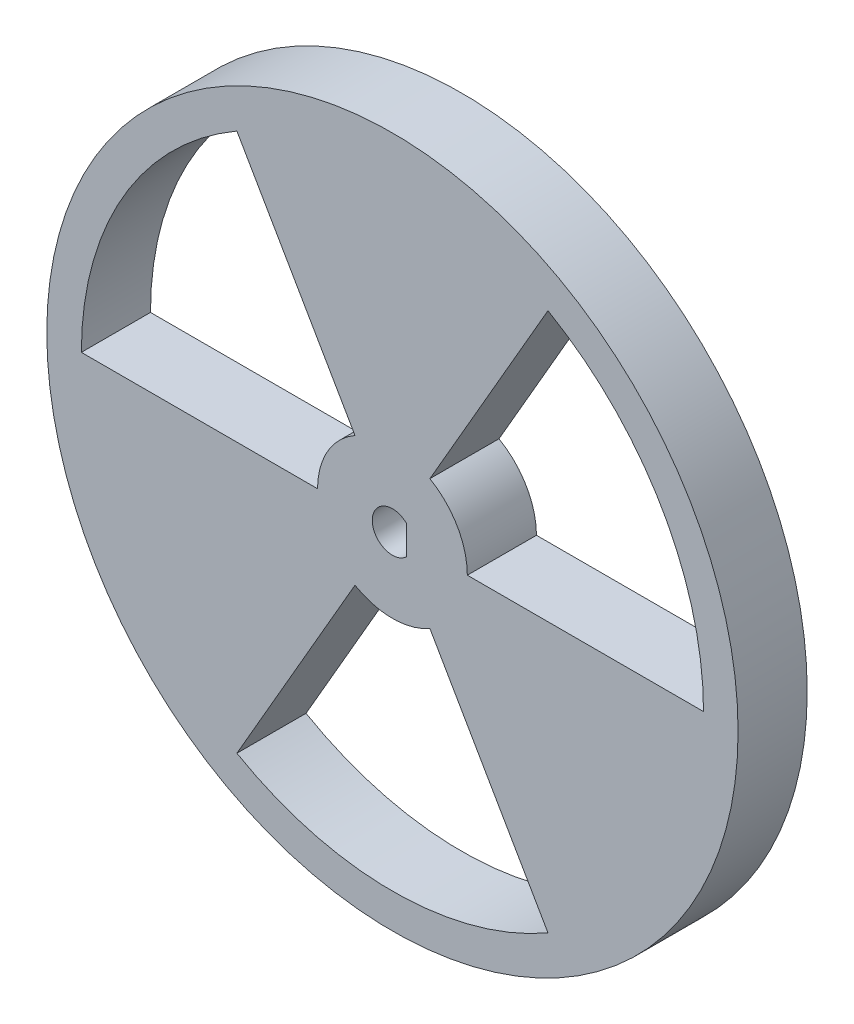
ISO-10303-21;
HEADER;
FILE_DESCRIPTION(('STEP AP214'),'2;1');
FILE_NAME('part.step','',(''),(''),'','','');
FILE_SCHEMA(('AUTOMOTIVE_DESIGN { 1 0 10303 214 1 1 1 1 }'));
ENDSEC;
DATA;
#1=APPLICATION_CONTEXT('core data for automotive mechanical design processes');
#2=APPLICATION_PROTOCOL_DEFINITION('international standard','automotive_design',2000,#1);
#3=PRODUCT_CONTEXT('',#1,'mechanical');
#4=PRODUCT('Part','Part','',(#3));
#5=PRODUCT_RELATED_PRODUCT_CATEGORY('part','',(#4));
#6=PRODUCT_DEFINITION_FORMATION('','',#4);
#7=PRODUCT_DEFINITION_CONTEXT('part definition',#1,'design');
#8=PRODUCT_DEFINITION('design','',#6,#7);
#9=PRODUCT_DEFINITION_SHAPE('','',#8);
#10=(LENGTH_UNIT() NAMED_UNIT(*) SI_UNIT(.MILLI.,.METRE.));
#11=(NAMED_UNIT(*) PLANE_ANGLE_UNIT() SI_UNIT($,.RADIAN.));
#12=(NAMED_UNIT(*) SI_UNIT($,.STERADIAN.) SOLID_ANGLE_UNIT());
#13=UNCERTAINTY_MEASURE_WITH_UNIT(LENGTH_MEASURE(1.E-05),#10,'distance_accuracy_value','');
#14=(GEOMETRIC_REPRESENTATION_CONTEXT(3) GLOBAL_UNCERTAINTY_ASSIGNED_CONTEXT((#13)) GLOBAL_UNIT_ASSIGNED_CONTEXT((#10,
#11,#12)) REPRESENTATION_CONTEXT('',''));
#15=CARTESIAN_POINT('',(0.,0.,0.));
#16=DIRECTION('',(0.,0.,1.));
#17=DIRECTION('',(1.,0.,0.));
#18=AXIS2_PLACEMENT_3D('',#15,#16,#17);
#19=CARTESIAN_POINT('',(0.,0.,12.));
#20=DIRECTION('',(0.,0.,-1.));
#21=DIRECTION('',(-1.,0.,0.));
#22=AXIS2_PLACEMENT_3D('',#19,#20,#21);
#23=CYLINDRICAL_SURFACE('',#22,60.);
#24=CARTESIAN_POINT('',(0.,0.,12.));
#25=DIRECTION('',(0.,0.,1.));
#26=DIRECTION('',(1.,0.,0.));
#27=AXIS2_PLACEMENT_3D('',#24,#25,#26);
#28=CIRCLE('',#27,60.);
#29=CARTESIAN_POINT('',(60.,0.,12.));
#30=VERTEX_POINT('',#29);
#31=EDGE_CURVE('E184',#30,#30,#28,.T.);
#32=ORIENTED_EDGE('',*,*,#31,.F.);
#33=EDGE_LOOP('',(#32));
#34=FACE_BOUND('',#33,.T.);
#35=CARTESIAN_POINT('',(0.,0.,0.));
#36=DIRECTION('',(0.,0.,1.));
#37=DIRECTION('',(1.,0.,0.));
#38=AXIS2_PLACEMENT_3D('',#35,#36,#37);
#39=CIRCLE('',#38,60.);
#40=CARTESIAN_POINT('',(60.,0.,0.));
#41=VERTEX_POINT('',#40);
#42=EDGE_CURVE('E165',#41,#41,#39,.T.);
#43=ORIENTED_EDGE('',*,*,#42,.T.);
#44=EDGE_LOOP('',(#43));
#45=FACE_BOUND('',#44,.T.);
#46=ADVANCED_FACE('F41',(#34,#45),#23,.T.);
#47=CARTESIAN_POINT('',(0.,0.,12.));
#48=DIRECTION('',(0.,1.,0.));
#49=DIRECTION('',(0.,0.,1.));
#50=AXIS2_PLACEMENT_3D('',#47,#48,#49);
#51=PLANE('',#50);
#52=DIRECTION('',(1.,0.,0.));
#53=VECTOR('',#52,1.);
#54=CARTESIAN_POINT('',(0.,0.,0.));
#55=LINE('',#54,#53);
#56=CARTESIAN_POINT('',(13.,0.,0.));
#57=VERTEX_POINT('',#56);
#58=CARTESIAN_POINT('',(54.,0.,0.));
#59=VERTEX_POINT('',#58);
#60=EDGE_CURVE('E191',#57,#59,#55,.T.);
#61=ORIENTED_EDGE('',*,*,#60,.F.);
#62=DIRECTION('',(0.,0.,-1.));
#63=VECTOR('',#62,1.);
#64=CARTESIAN_POINT('',(13.,0.,12.));
#65=LINE('',#64,#63);
#66=CARTESIAN_POINT('',(13.,0.,12.));
#67=VERTEX_POINT('',#66);
#68=EDGE_CURVE('E50',#67,#57,#65,.T.);
#69=ORIENTED_EDGE('',*,*,#68,.F.);
#70=DIRECTION('',(1.,0.,0.));
#71=VECTOR('',#70,1.);
#72=CARTESIAN_POINT('',(0.,0.,12.));
#73=LINE('',#72,#71);
#74=CARTESIAN_POINT('',(54.,0.,12.));
#75=VERTEX_POINT('',#74);
#76=EDGE_CURVE('E164',#67,#75,#73,.T.);
#77=ORIENTED_EDGE('',*,*,#76,.T.);
#78=DIRECTION('',(0.,0.,-1.));
#79=VECTOR('',#78,1.);
#80=CARTESIAN_POINT('',(54.,0.,12.));
#81=LINE('',#80,#79);
#82=EDGE_CURVE('E12',#75,#59,#81,.T.);
#83=ORIENTED_EDGE('',*,*,#82,.T.);
#84=EDGE_LOOP('',(#61,#69,#77,#83));
#85=FACE_BOUND('',#84,.T.);
#86=ADVANCED_FACE('F298',(#85),#51,.T.);
#87=CARTESIAN_POINT('',(0.,0.,12.));
#88=DIRECTION('',(0.866025403784439,0.5,0.));
#89=DIRECTION('',(-0.5,0.866025403784439,0.));
#90=AXIS2_PLACEMENT_3D('',#87,#88,#89);
#91=PLANE('',#90);
#92=DIRECTION('',(0.5,-0.866025403784439,0.));
#93=VECTOR('',#92,1.);
#94=CARTESIAN_POINT('',(0.,0.,0.));
#95=LINE('',#94,#93);
#96=CARTESIAN_POINT('',(6.5,-11.2583302491977,0.));
#97=VERTEX_POINT('',#96);
#98=CARTESIAN_POINT('',(27.,-46.7653718043597,0.));
#99=VERTEX_POINT('',#98);
#100=EDGE_CURVE('E197',#97,#99,#95,.T.);
#101=ORIENTED_EDGE('',*,*,#100,.T.);
#102=DIRECTION('',(0.,0.,-1.));
#103=VECTOR('',#102,1.);
#104=CARTESIAN_POINT('',(27.,-46.7653718043597,12.));
#105=LINE('',#104,#103);
#106=CARTESIAN_POINT('',(27.,-46.7653718043597,12.));
#107=VERTEX_POINT('',#106);
#108=EDGE_CURVE('E229',#107,#99,#105,.T.);
#109=ORIENTED_EDGE('',*,*,#108,.F.);
#110=DIRECTION('',(0.5,-0.866025403784439,0.));
#111=VECTOR('',#110,1.);
#112=CARTESIAN_POINT('',(0.,0.,12.));
#113=LINE('',#112,#111);
#114=CARTESIAN_POINT('',(6.5,-11.2583302491977,12.));
#115=VERTEX_POINT('',#114);
#116=EDGE_CURVE('E170',#115,#107,#113,.T.);
#117=ORIENTED_EDGE('',*,*,#116,.F.);
#118=DIRECTION('',(0.,0.,-1.));
#119=VECTOR('',#118,1.);
#120=CARTESIAN_POINT('',(6.5,-11.2583302491977,12.));
#121=LINE('',#120,#119);
#122=EDGE_CURVE('E231',#115,#97,#121,.T.);
#123=ORIENTED_EDGE('',*,*,#122,.T.);
#124=EDGE_LOOP('',(#101,#109,#117,#123));
#125=FACE_BOUND('',#124,.T.);
#126=ADVANCED_FACE('F261',(#125),#91,.F.);
#127=CARTESIAN_POINT('',(0.,0.,12.));
#128=DIRECTION('',(0.,0.,-1.));
#129=DIRECTION('',(-1.,0.,0.));
#130=AXIS2_PLACEMENT_3D('',#127,#128,#129);
#131=CYLINDRICAL_SURFACE('',#130,54.);
#132=CARTESIAN_POINT('',(0.,0.,0.));
#133=DIRECTION('',(0.,0.,1.));
#134=DIRECTION('',(1.,0.,0.));
#135=AXIS2_PLACEMENT_3D('',#132,#133,#134);
#136=CIRCLE('',#135,54.);
#137=CARTESIAN_POINT('',(-27.,-46.7653718043597,0.));
#138=VERTEX_POINT('',#137);
#139=EDGE_CURVE('E194',#138,#99,#136,.T.);
#140=ORIENTED_EDGE('',*,*,#139,.F.);
#141=DIRECTION('',(0.,0.,-1.));
#142=VECTOR('',#141,1.);
#143=CARTESIAN_POINT('',(-27.,-46.7653718043597,12.));
#144=LINE('',#143,#142);
#145=CARTESIAN_POINT('',(-27.,-46.7653718043597,12.));
#146=VERTEX_POINT('',#145);
#147=EDGE_CURVE('E227',#146,#138,#144,.T.);
#148=ORIENTED_EDGE('',*,*,#147,.F.);
#149=CARTESIAN_POINT('',(0.,0.,12.));
#150=DIRECTION('',(0.,0.,1.));
#151=DIRECTION('',(1.,0.,0.));
#152=AXIS2_PLACEMENT_3D('',#149,#150,#151);
#153=CIRCLE('',#152,54.);
#154=EDGE_CURVE('E167',#146,#107,#153,.T.);
#155=ORIENTED_EDGE('',*,*,#154,.T.);
#156=ORIENTED_EDGE('',*,*,#108,.T.);
#157=EDGE_LOOP('',(#140,#148,#155,#156));
#158=FACE_BOUND('',#157,.T.);
#159=ADVANCED_FACE('F318',(#158),#131,.F.);
#160=CARTESIAN_POINT('',(0.,0.,12.));
#161=DIRECTION('',(-0.866025403784439,0.5,0.));
#162=DIRECTION('',(-0.5,-0.866025403784439,0.));
#163=AXIS2_PLACEMENT_3D('',#160,#161,#162);
#164=PLANE('',#163);
#165=DIRECTION('',(0.5,0.866025403784439,0.));
#166=VECTOR('',#165,1.);
#167=CARTESIAN_POINT('',(0.,0.,0.));
#168=LINE('',#167,#166);
#169=CARTESIAN_POINT('',(-6.5,-11.2583302491977,0.));
#170=VERTEX_POINT('',#169);
#171=EDGE_CURVE('E200',#138,#170,#168,.T.);
#172=ORIENTED_EDGE('',*,*,#171,.T.);
#173=DIRECTION('',(0.,0.,-1.));
#174=VECTOR('',#173,1.);
#175=CARTESIAN_POINT('',(-6.5,-11.2583302491977,12.));
#176=LINE('',#175,#174);
#177=CARTESIAN_POINT('',(-6.5,-11.2583302491977,12.));
#178=VERTEX_POINT('',#177);
#179=EDGE_CURVE('E225',#178,#170,#176,.T.);
#180=ORIENTED_EDGE('',*,*,#179,.F.);
#181=DIRECTION('',(0.5,0.866025403784439,0.));
#182=VECTOR('',#181,1.);
#183=CARTESIAN_POINT('',(0.,0.,12.));
#184=LINE('',#183,#182);
#185=EDGE_CURVE('E172',#146,#178,#184,.T.);
#186=ORIENTED_EDGE('',*,*,#185,.F.);
#187=ORIENTED_EDGE('',*,*,#147,.T.);
#188=EDGE_LOOP('',(#172,#180,#186,#187));
#189=FACE_BOUND('',#188,.T.);
#190=ADVANCED_FACE('F321',(#189),#164,.F.);
#191=CARTESIAN_POINT('',(0.,0.,12.));
#192=DIRECTION('',(0.,1.,0.));
#193=DIRECTION('',(0.,0.,1.));
#194=AXIS2_PLACEMENT_3D('',#191,#192,#193);
#195=PLANE('',#194);
#196=DIRECTION('',(1.,0.,0.));
#197=VECTOR('',#196,1.);
#198=CARTESIAN_POINT('',(0.,0.,0.));
#199=LINE('',#198,#197);
#200=CARTESIAN_POINT('',(-54.,0.,0.));
#201=VERTEX_POINT('',#200);
#202=CARTESIAN_POINT('',(-13.,0.,0.));
#203=VERTEX_POINT('',#202);
#204=EDGE_CURVE('E203',#201,#203,#199,.T.);
#205=ORIENTED_EDGE('',*,*,#204,.F.);
#206=DIRECTION('',(0.,0.,-1.));
#207=VECTOR('',#206,1.);
#208=CARTESIAN_POINT('',(-54.,0.,12.));
#209=LINE('',#208,#207);
#210=CARTESIAN_POINT('',(-54.,0.,12.));
#211=VERTEX_POINT('',#210);
#212=EDGE_CURVE('E221',#211,#201,#209,.T.);
#213=ORIENTED_EDGE('',*,*,#212,.F.);
#214=DIRECTION('',(1.,0.,0.));
#215=VECTOR('',#214,1.);
#216=CARTESIAN_POINT('',(0.,0.,12.));
#217=LINE('',#216,#215);
#218=CARTESIAN_POINT('',(-13.,0.,12.));
#219=VERTEX_POINT('',#218);
#220=EDGE_CURVE('E175',#211,#219,#217,.T.);
#221=ORIENTED_EDGE('',*,*,#220,.T.);
#222=DIRECTION('',(0.,0.,-1.));
#223=VECTOR('',#222,1.);
#224=CARTESIAN_POINT('',(-13.,0.,12.));
#225=LINE('',#224,#223);
#226=EDGE_CURVE('E223',#219,#203,#225,.T.);
#227=ORIENTED_EDGE('',*,*,#226,.T.);
#228=EDGE_LOOP('',(#205,#213,#221,#227));
#229=FACE_BOUND('',#228,.T.);
#230=ADVANCED_FACE('F278',(#229),#195,.T.);
#231=CARTESIAN_POINT('',(-27.,46.7653718043597,0.));
#232=VERTEX_POINT('',#231);
#233=EDGE_CURVE('E193',#232,#201,#136,.T.);
#234=ORIENTED_EDGE('',*,*,#233,.F.);
#235=DIRECTION('',(0.,0.,-1.));
#236=VECTOR('',#235,1.);
#237=CARTESIAN_POINT('',(-27.,46.7653718043597,12.));
#238=LINE('',#237,#236);
#239=CARTESIAN_POINT('',(-27.,46.7653718043597,12.));
#240=VERTEX_POINT('',#239);
#241=EDGE_CURVE('E219',#240,#232,#238,.T.);
#242=ORIENTED_EDGE('',*,*,#241,.F.);
#243=EDGE_CURVE('E166',#240,#211,#153,.T.);
#244=ORIENTED_EDGE('',*,*,#243,.T.);
#245=ORIENTED_EDGE('',*,*,#212,.T.);
#246=EDGE_LOOP('',(#234,#242,#244,#245));
#247=FACE_BOUND('',#246,.T.);
#248=ADVANCED_FACE('F271',(#247),#131,.F.);
#249=CARTESIAN_POINT('',(0.,0.,12.));
#250=DIRECTION('',(0.866025403784439,0.5,0.));
#251=DIRECTION('',(-0.5,0.866025403784439,0.));
#252=AXIS2_PLACEMENT_3D('',#249,#250,#251);
#253=PLANE('',#252);
#254=DIRECTION('',(0.5,-0.866025403784439,0.));
#255=VECTOR('',#254,1.);
#256=CARTESIAN_POINT('',(0.,0.,0.));
#257=LINE('',#256,#255);
#258=CARTESIAN_POINT('',(-6.5,11.2583302491977,0.));
#259=VERTEX_POINT('',#258);
#260=EDGE_CURVE('E206',#232,#259,#257,.T.);
#261=ORIENTED_EDGE('',*,*,#260,.T.);
#262=DIRECTION('',(0.,0.,-1.));
#263=VECTOR('',#262,1.);
#264=CARTESIAN_POINT('',(-6.5,11.2583302491977,12.));
#265=LINE('',#264,#263);
#266=CARTESIAN_POINT('',(-6.5,11.2583302491977,12.));
#267=VERTEX_POINT('',#266);
#268=EDGE_CURVE('E217',#267,#259,#265,.T.);
#269=ORIENTED_EDGE('',*,*,#268,.F.);
#270=DIRECTION('',(0.5,-0.866025403784439,0.));
#271=VECTOR('',#270,1.);
#272=CARTESIAN_POINT('',(0.,0.,12.));
#273=LINE('',#272,#271);
#274=EDGE_CURVE('E178',#240,#267,#273,.T.);
#275=ORIENTED_EDGE('',*,*,#274,.F.);
#276=ORIENTED_EDGE('',*,*,#241,.T.);
#277=EDGE_LOOP('',(#261,#269,#275,#276));
#278=FACE_BOUND('',#277,.T.);
#279=ADVANCED_FACE('F284',(#278),#253,.F.);
#280=CARTESIAN_POINT('',(0.,0.,12.));
#281=DIRECTION('',(0.866025403784439,-0.5,0.));
#282=DIRECTION('',(0.5,0.866025403784439,0.));
#283=AXIS2_PLACEMENT_3D('',#280,#281,#282);
#284=PLANE('',#283);
#285=DIRECTION('',(-0.5,-0.866025403784439,0.));
#286=VECTOR('',#285,1.);
#287=CARTESIAN_POINT('',(0.,0.,0.));
#288=LINE('',#287,#286);
#289=CARTESIAN_POINT('',(27.,46.7653718043597,0.));
#290=VERTEX_POINT('',#289);
#291=CARTESIAN_POINT('',(6.5,11.2583302491977,0.));
#292=VERTEX_POINT('',#291);
#293=EDGE_CURVE('E209',#290,#292,#288,.T.);
#294=ORIENTED_EDGE('',*,*,#293,.F.);
#295=DIRECTION('',(0.,0.,-1.));
#296=VECTOR('',#295,1.);
#297=CARTESIAN_POINT('',(27.,46.7653718043597,12.));
#298=LINE('',#297,#296);
#299=CARTESIAN_POINT('',(27.,46.7653718043597,12.));
#300=VERTEX_POINT('',#299);
#301=EDGE_CURVE('E187',#300,#290,#298,.T.);
#302=ORIENTED_EDGE('',*,*,#301,.F.);
#303=DIRECTION('',(-0.5,-0.866025403784439,0.));
#304=VECTOR('',#303,1.);
#305=CARTESIAN_POINT('',(0.,0.,12.));
#306=LINE('',#305,#304);
#307=CARTESIAN_POINT('',(6.5,11.2583302491977,12.));
#308=VERTEX_POINT('',#307);
#309=EDGE_CURVE('E181',#300,#308,#306,.T.);
#310=ORIENTED_EDGE('',*,*,#309,.T.);
#311=DIRECTION('',(0.,0.,-1.));
#312=VECTOR('',#311,1.);
#313=CARTESIAN_POINT('',(6.5,11.2583302491977,12.));
#314=LINE('',#313,#312);
#315=EDGE_CURVE('E215',#308,#292,#314,.T.);
#316=ORIENTED_EDGE('',*,*,#315,.T.);
#317=EDGE_LOOP('',(#294,#302,#310,#316));
#318=FACE_BOUND('',#317,.T.);
#319=ADVANCED_FACE('F309',(#318),#284,.T.);
#320=EDGE_CURVE('E188',#59,#290,#136,.T.);
#321=ORIENTED_EDGE('',*,*,#320,.F.);
#322=ORIENTED_EDGE('',*,*,#82,.F.);
#323=EDGE_CURVE('E161',#75,#300,#153,.T.);
#324=ORIENTED_EDGE('',*,*,#323,.T.);
#325=ORIENTED_EDGE('',*,*,#301,.T.);
#326=EDGE_LOOP('',(#321,#322,#324,#325));
#327=FACE_BOUND('',#326,.T.);
#328=ADVANCED_FACE('F312',(#327),#131,.F.);
#329=CARTESIAN_POINT('',(0.,0.,0.));
#330=DIRECTION('',(0.,0.,1.));
#331=DIRECTION('',(1.,0.,0.));
#332=AXIS2_PLACEMENT_3D('',#329,#330,#331);
#333=PLANE('',#332);
#334=DIRECTION('',(0.,-1.,0.));
#335=VECTOR('',#334,1.);
#336=CARTESIAN_POINT('',(2.44948974278318,2.5,0.));
#337=LINE('',#336,#335);
#338=CARTESIAN_POINT('',(2.44948974278318,2.5,0.));
#339=VERTEX_POINT('',#338);
#340=CARTESIAN_POINT('',(2.44948974278318,-2.5,0.));
#341=VERTEX_POINT('',#340);
#342=EDGE_CURVE('E158',#339,#341,#337,.T.);
#343=ORIENTED_EDGE('',*,*,#342,.F.);
#344=CARTESIAN_POINT('',(0.,0.,0.));
#345=DIRECTION('',(0.,0.,1.));
#346=DIRECTION('',(1.,0.,0.));
#347=AXIS2_PLACEMENT_3D('',#344,#345,#346);
#348=CIRCLE('',#347,3.5);
#349=EDGE_CURVE('E143',#341,#339,#348,.F.);
#350=ORIENTED_EDGE('',*,*,#349,.F.);
#351=EDGE_LOOP('',(#343,#350));
#352=FACE_BOUND('',#351,.T.);
#353=CARTESIAN_POINT('',(0.,0.,0.));
#354=DIRECTION('',(0.,0.,1.));
#355=DIRECTION('',(1.,0.,0.));
#356=AXIS2_PLACEMENT_3D('',#353,#354,#355);
#357=CIRCLE('',#356,13.);
#358=EDGE_CURVE('E45',#57,#292,#357,.T.);
#359=ORIENTED_EDGE('',*,*,#358,.F.);
#360=ORIENTED_EDGE('',*,*,#60,.T.);
#361=ORIENTED_EDGE('',*,*,#320,.T.);
#362=ORIENTED_EDGE('',*,*,#293,.T.);
#363=EDGE_LOOP('',(#359,#360,#361,#362));
#364=FACE_BOUND('',#363,.T.);
#365=EDGE_CURVE('E160',#170,#97,#357,.T.);
#366=ORIENTED_EDGE('',*,*,#365,.F.);
#367=ORIENTED_EDGE('',*,*,#171,.F.);
#368=ORIENTED_EDGE('',*,*,#139,.T.);
#369=ORIENTED_EDGE('',*,*,#100,.F.);
#370=EDGE_LOOP('',(#366,#367,#368,#369));
#371=FACE_BOUND('',#370,.T.);
#372=ORIENTED_EDGE('',*,*,#204,.T.);
#373=EDGE_CURVE('E245',#259,#203,#357,.T.);
#374=ORIENTED_EDGE('',*,*,#373,.F.);
#375=ORIENTED_EDGE('',*,*,#260,.F.);
#376=ORIENTED_EDGE('',*,*,#233,.T.);
#377=EDGE_LOOP('',(#372,#374,#375,#376));
#378=FACE_BOUND('',#377,.T.);
#379=ORIENTED_EDGE('',*,*,#42,.F.);
#380=EDGE_LOOP('',(#379));
#381=FACE_BOUND('',#380,.T.);
#382=ADVANCED_FACE('F256',(#352,#364,#371,#378,#381),#333,.F.);
#383=CARTESIAN_POINT('',(0.,0.,12.));
#384=DIRECTION('',(0.,0.,1.));
#385=DIRECTION('',(1.,0.,0.));
#386=AXIS2_PLACEMENT_3D('',#383,#384,#385);
#387=PLANE('',#386);
#388=CARTESIAN_POINT('',(0.,0.,12.));
#389=DIRECTION('',(0.,0.,1.));
#390=DIRECTION('',(1.,0.,0.));
#391=AXIS2_PLACEMENT_3D('',#388,#389,#390);
#392=CIRCLE('',#391,3.5);
#393=CARTESIAN_POINT('',(2.44948974278318,2.5,12.));
#394=VERTEX_POINT('',#393);
#395=CARTESIAN_POINT('',(2.44948974278318,-2.5,12.));
#396=VERTEX_POINT('',#395);
#397=EDGE_CURVE('E65',#394,#396,#392,.T.);
#398=ORIENTED_EDGE('',*,*,#397,.F.);
#399=DIRECTION('',(0.,1.,0.));
#400=VECTOR('',#399,1.);
#401=CARTESIAN_POINT('',(2.44948974278318,2.5,12.));
#402=LINE('',#401,#400);
#403=EDGE_CURVE('E148',#396,#394,#402,.T.);
#404=ORIENTED_EDGE('',*,*,#403,.F.);
#405=EDGE_LOOP('',(#398,#404));
#406=FACE_BOUND('',#405,.T.);
#407=ORIENTED_EDGE('',*,*,#76,.F.);
#408=CARTESIAN_POINT('',(0.,0.,12.));
#409=DIRECTION('',(0.,0.,1.));
#410=DIRECTION('',(1.,0.,0.));
#411=AXIS2_PLACEMENT_3D('',#408,#409,#410);
#412=CIRCLE('',#411,13.);
#413=EDGE_CURVE('E192',#67,#308,#412,.T.);
#414=ORIENTED_EDGE('',*,*,#413,.T.);
#415=ORIENTED_EDGE('',*,*,#309,.F.);
#416=ORIENTED_EDGE('',*,*,#323,.F.);
#417=EDGE_LOOP('',(#407,#414,#415,#416));
#418=FACE_BOUND('',#417,.T.);
#419=ORIENTED_EDGE('',*,*,#185,.T.);
#420=EDGE_CURVE('E235',#178,#115,#412,.T.);
#421=ORIENTED_EDGE('',*,*,#420,.T.);
#422=ORIENTED_EDGE('',*,*,#116,.T.);
#423=ORIENTED_EDGE('',*,*,#154,.F.);
#424=EDGE_LOOP('',(#419,#421,#422,#423));
#425=FACE_BOUND('',#424,.T.);
#426=EDGE_CURVE('E234',#267,#219,#412,.T.);
#427=ORIENTED_EDGE('',*,*,#426,.T.);
#428=ORIENTED_EDGE('',*,*,#220,.F.);
#429=ORIENTED_EDGE('',*,*,#243,.F.);
#430=ORIENTED_EDGE('',*,*,#274,.T.);
#431=EDGE_LOOP('',(#427,#428,#429,#430));
#432=FACE_BOUND('',#431,.T.);
#433=ORIENTED_EDGE('',*,*,#31,.T.);
#434=EDGE_LOOP('',(#433));
#435=FACE_BOUND('',#434,.T.);
#436=ADVANCED_FACE('F152',(#406,#418,#425,#432,#435),#387,.T.);
#437=CARTESIAN_POINT('',(0.,0.,12.));
#438=DIRECTION('',(0.,0.,-1.));
#439=DIRECTION('',(-1.,0.,0.));
#440=AXIS2_PLACEMENT_3D('',#437,#438,#439);
#441=CYLINDRICAL_SURFACE('',#440,13.);
#442=ORIENTED_EDGE('',*,*,#226,.F.);
#443=ORIENTED_EDGE('',*,*,#426,.F.);
#444=ORIENTED_EDGE('',*,*,#268,.T.);
#445=ORIENTED_EDGE('',*,*,#373,.T.);
#446=EDGE_LOOP('',(#442,#443,#444,#445));
#447=FACE_BOUND('',#446,.T.);
#448=ADVANCED_FACE('F286',(#447),#441,.T.);
#449=ORIENTED_EDGE('',*,*,#365,.T.);
#450=ORIENTED_EDGE('',*,*,#122,.F.);
#451=ORIENTED_EDGE('',*,*,#420,.F.);
#452=ORIENTED_EDGE('',*,*,#179,.T.);
#453=EDGE_LOOP('',(#449,#450,#451,#452));
#454=FACE_BOUND('',#453,.T.);
#455=ADVANCED_FACE('F43',(#454),#441,.T.);
#456=ORIENTED_EDGE('',*,*,#68,.T.);
#457=ORIENTED_EDGE('',*,*,#358,.T.);
#458=ORIENTED_EDGE('',*,*,#315,.F.);
#459=ORIENTED_EDGE('',*,*,#413,.F.);
#460=EDGE_LOOP('',(#456,#457,#458,#459));
#461=FACE_BOUND('',#460,.T.);
#462=ADVANCED_FACE('F288',(#461),#441,.T.);
#463=CARTESIAN_POINT('',(0.,0.,-9.18675286483109));
#464=DIRECTION('',(0.,0.,1.));
#465=DIRECTION('',(1.,0.,0.));
#466=AXIS2_PLACEMENT_3D('',#463,#464,#465);
#467=CYLINDRICAL_SURFACE('',#466,3.5);
#468=ORIENTED_EDGE('',*,*,#349,.T.);
#469=DIRECTION('',(0.,0.,1.));
#470=VECTOR('',#469,1.);
#471=CARTESIAN_POINT('',(2.44948974278318,2.5,-9.18675286483109));
#472=LINE('',#471,#470);
#473=EDGE_CURVE('E58',#339,#394,#472,.T.);
#474=ORIENTED_EDGE('',*,*,#473,.T.);
#475=ORIENTED_EDGE('',*,*,#397,.T.);
#476=DIRECTION('',(0.,0.,1.));
#477=VECTOR('',#476,1.);
#478=CARTESIAN_POINT('',(2.44948974278318,-2.5,-9.18675286483109));
#479=LINE('',#478,#477);
#480=EDGE_CURVE('E145',#341,#396,#479,.T.);
#481=ORIENTED_EDGE('',*,*,#480,.F.);
#482=EDGE_LOOP('',(#468,#474,#475,#481));
#483=FACE_BOUND('',#482,.T.);
#484=ADVANCED_FACE('F141',(#483),#467,.F.);
#485=CARTESIAN_POINT('',(2.44948974278318,2.5,-9.18675286483109));
#486=DIRECTION('',(1.,0.,0.));
#487=DIRECTION('',(0.,0.,-1.));
#488=AXIS2_PLACEMENT_3D('',#485,#486,#487);
#489=PLANE('',#488);
#490=ORIENTED_EDGE('',*,*,#342,.T.);
#491=ORIENTED_EDGE('',*,*,#480,.T.);
#492=ORIENTED_EDGE('',*,*,#403,.T.);
#493=ORIENTED_EDGE('',*,*,#473,.F.);
#494=EDGE_LOOP('',(#490,#491,#492,#493));
#495=FACE_BOUND('',#494,.T.);
#496=ADVANCED_FACE('F149',(#495),#489,.F.);
#497=CLOSED_SHELL('',(#46,#86,#126,#159,#190,#230,#248,#279,#319,#328,#382,#436,#448,#455,#462,
#484,#496));
#498=MANIFOLD_SOLID_BREP('B2',#497);
#499=ADVANCED_BREP_SHAPE_REPRESENTATION('',(#18,#498),#14);
#500=SHAPE_DEFINITION_REPRESENTATION(#9,#499);
ENDSEC;
END-ISO-10303-21;
